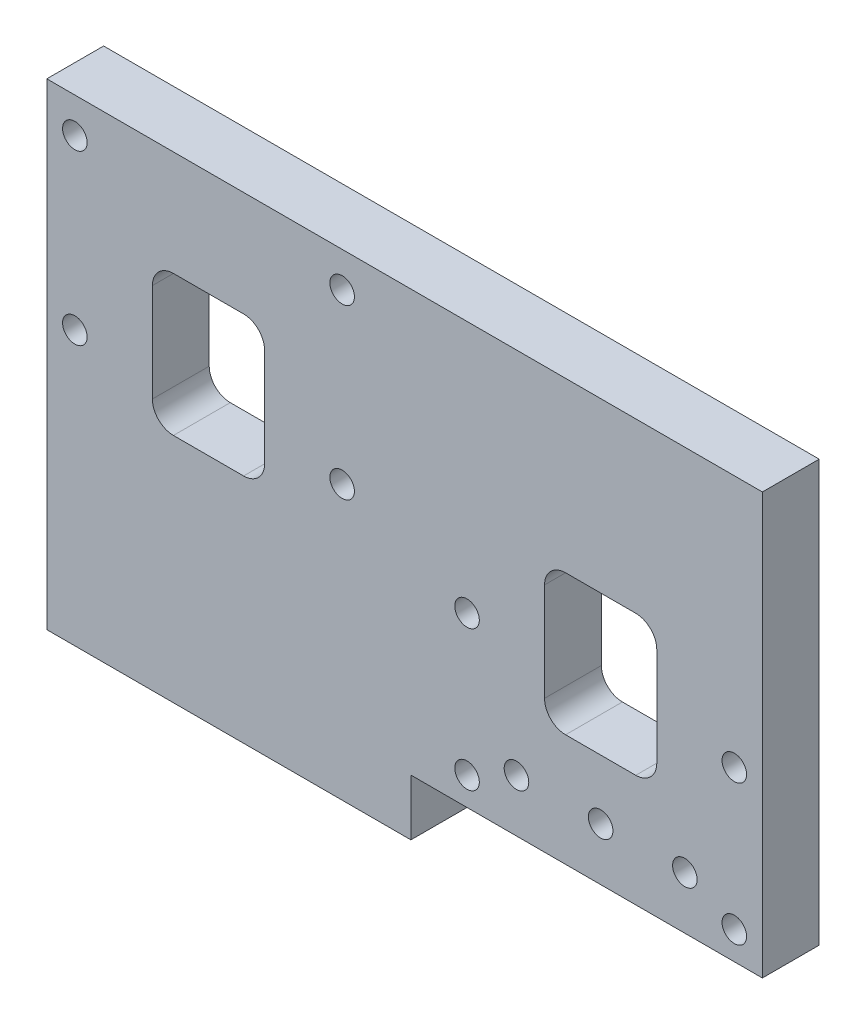
ISO-10303-21;
HEADER;
FILE_DESCRIPTION(('STEP AP214'),'2;1');
FILE_NAME('part.step','',(''),(''),'','','');
FILE_SCHEMA(('AUTOMOTIVE_DESIGN { 1 0 10303 214 1 1 1 1 }'));
ENDSEC;
DATA;
#1=APPLICATION_CONTEXT('core data for automotive mechanical design processes');
#2=APPLICATION_PROTOCOL_DEFINITION('international standard','automotive_design',2000,#1);
#3=PRODUCT_CONTEXT('',#1,'mechanical');
#4=PRODUCT('Part','Part','',(#3));
#5=PRODUCT_RELATED_PRODUCT_CATEGORY('part','',(#4));
#6=PRODUCT_DEFINITION_FORMATION('','',#4);
#7=PRODUCT_DEFINITION_CONTEXT('part definition',#1,'design');
#8=PRODUCT_DEFINITION('design','',#6,#7);
#9=PRODUCT_DEFINITION_SHAPE('','',#8);
#10=(LENGTH_UNIT() NAMED_UNIT(*) SI_UNIT(.MILLI.,.METRE.));
#11=(NAMED_UNIT(*) PLANE_ANGLE_UNIT() SI_UNIT($,.RADIAN.));
#12=(NAMED_UNIT(*) SI_UNIT($,.STERADIAN.) SOLID_ANGLE_UNIT());
#13=UNCERTAINTY_MEASURE_WITH_UNIT(LENGTH_MEASURE(1.E-05),#10,'distance_accuracy_value','');
#14=(GEOMETRIC_REPRESENTATION_CONTEXT(3) GLOBAL_UNCERTAINTY_ASSIGNED_CONTEXT((#13)) GLOBAL_UNIT_ASSIGNED_CONTEXT((#10,
#11,#12)) REPRESENTATION_CONTEXT('',''));
#15=CARTESIAN_POINT('',(0.,0.,0.));
#16=DIRECTION('',(0.,0.,1.));
#17=DIRECTION('',(1.,0.,0.));
#18=AXIS2_PLACEMENT_3D('',#15,#16,#17);
#19=CARTESIAN_POINT('',(0.,0.,8.1));
#20=DIRECTION('',(0.,1.,0.));
#21=DIRECTION('',(0.,0.,1.));
#22=AXIS2_PLACEMENT_3D('',#19,#20,#21);
#23=PLANE('',#22);
#24=DIRECTION('',(0.,0.,1.));
#25=VECTOR('',#24,1.);
#26=CARTESIAN_POINT('',(51.9,0.,0.));
#27=LINE('',#26,#25);
#28=CARTESIAN_POINT('',(51.9,0.,0.));
#29=VERTEX_POINT('',#28);
#30=CARTESIAN_POINT('',(51.9,0.,8.1));
#31=VERTEX_POINT('',#30);
#32=EDGE_CURVE('E222',#29,#31,#27,.T.);
#33=ORIENTED_EDGE('',*,*,#32,.F.);
#34=DIRECTION('',(1.,0.,0.));
#35=VECTOR('',#34,1.);
#36=CARTESIAN_POINT('',(0.,0.,0.));
#37=LINE('',#36,#35);
#38=CARTESIAN_POINT('',(102.,0.,0.));
#39=VERTEX_POINT('',#38);
#40=EDGE_CURVE('E195',#29,#39,#37,.T.);
#41=ORIENTED_EDGE('',*,*,#40,.T.);
#42=DIRECTION('',(0.,0.,-1.));
#43=VECTOR('',#42,1.);
#44=CARTESIAN_POINT('',(102.,0.,8.1));
#45=LINE('',#44,#43);
#46=CARTESIAN_POINT('',(102.,0.,8.1));
#47=VERTEX_POINT('',#46);
#48=EDGE_CURVE('E308',#47,#39,#45,.T.);
#49=ORIENTED_EDGE('',*,*,#48,.F.);
#50=DIRECTION('',(1.,0.,0.));
#51=VECTOR('',#50,1.);
#52=CARTESIAN_POINT('',(0.,0.,8.1));
#53=LINE('',#52,#51);
#54=EDGE_CURVE('E293',#31,#47,#53,.T.);
#55=ORIENTED_EDGE('',*,*,#54,.F.);
#56=EDGE_LOOP('',(#33,#41,#49,#55));
#57=FACE_BOUND('',#56,.T.);
#58=ADVANCED_FACE('F33',(#57),#23,.F.);
#59=CARTESIAN_POINT('',(0.,0.,8.1));
#60=DIRECTION('',(1.,0.,0.));
#61=DIRECTION('',(0.,0.,-1.));
#62=AXIS2_PLACEMENT_3D('',#59,#60,#61);
#63=PLANE('',#62);
#64=DIRECTION('',(0.,-1.,0.));
#65=VECTOR('',#64,1.);
#66=CARTESIAN_POINT('',(0.,0.,0.));
#67=LINE('',#66,#65);
#68=CARTESIAN_POINT('',(0.,60.,0.));
#69=VERTEX_POINT('',#68);
#70=CARTESIAN_POINT('',(0.,-8.,0.));
#71=VERTEX_POINT('',#70);
#72=EDGE_CURVE('E184',#69,#71,#67,.T.);
#73=ORIENTED_EDGE('',*,*,#72,.T.);
#74=DIRECTION('',(0.,0.,1.));
#75=VECTOR('',#74,1.);
#76=CARTESIAN_POINT('',(0.,-8.,0.));
#77=LINE('',#76,#75);
#78=CARTESIAN_POINT('',(0.,-8.,8.1));
#79=VERTEX_POINT('',#78);
#80=EDGE_CURVE('E188',#71,#79,#77,.T.);
#81=ORIENTED_EDGE('',*,*,#80,.T.);
#82=DIRECTION('',(0.,-1.,0.));
#83=VECTOR('',#82,1.);
#84=CARTESIAN_POINT('',(0.,0.,8.1));
#85=LINE('',#84,#83);
#86=CARTESIAN_POINT('',(0.,60.,8.1));
#87=VERTEX_POINT('',#86);
#88=EDGE_CURVE('E291',#87,#79,#85,.T.);
#89=ORIENTED_EDGE('',*,*,#88,.F.);
#90=DIRECTION('',(0.,0.,-1.));
#91=VECTOR('',#90,1.);
#92=CARTESIAN_POINT('',(0.,60.,8.1));
#93=LINE('',#92,#91);
#94=EDGE_CURVE('E191',#87,#69,#93,.T.);
#95=ORIENTED_EDGE('',*,*,#94,.T.);
#96=EDGE_LOOP('',(#73,#81,#89,#95));
#97=FACE_BOUND('',#96,.T.);
#98=ADVANCED_FACE('F186',(#97),#63,.F.);
#99=CARTESIAN_POINT('',(102.,0.,8.1));
#100=DIRECTION('',(-1.,0.,0.));
#101=DIRECTION('',(0.,0.,1.));
#102=AXIS2_PLACEMENT_3D('',#99,#100,#101);
#103=PLANE('',#102);
#104=DIRECTION('',(0.,1.,0.));
#105=VECTOR('',#104,1.);
#106=CARTESIAN_POINT('',(102.,0.,0.));
#107=LINE('',#106,#105);
#108=CARTESIAN_POINT('',(102.,60.,0.));
#109=VERTEX_POINT('',#108);
#110=EDGE_CURVE('E301',#39,#109,#107,.T.);
#111=ORIENTED_EDGE('',*,*,#110,.T.);
#112=DIRECTION('',(0.,0.,-1.));
#113=VECTOR('',#112,1.);
#114=CARTESIAN_POINT('',(102.,60.,8.1));
#115=LINE('',#114,#113);
#116=CARTESIAN_POINT('',(102.,60.,8.1));
#117=VERTEX_POINT('',#116);
#118=EDGE_CURVE('E305',#117,#109,#115,.T.);
#119=ORIENTED_EDGE('',*,*,#118,.F.);
#120=DIRECTION('',(0.,1.,0.));
#121=VECTOR('',#120,1.);
#122=CARTESIAN_POINT('',(102.,0.,8.1));
#123=LINE('',#122,#121);
#124=EDGE_CURVE('E296',#47,#117,#123,.T.);
#125=ORIENTED_EDGE('',*,*,#124,.F.);
#126=ORIENTED_EDGE('',*,*,#48,.T.);
#127=EDGE_LOOP('',(#111,#119,#125,#126));
#128=FACE_BOUND('',#127,.T.);
#129=ADVANCED_FACE('F439',(#128),#103,.F.);
#130=CARTESIAN_POINT('',(0.,60.,8.1));
#131=DIRECTION('',(0.,-1.,0.));
#132=DIRECTION('',(0.,0.,-1.));
#133=AXIS2_PLACEMENT_3D('',#130,#131,#132);
#134=PLANE('',#133);
#135=DIRECTION('',(-1.,0.,0.));
#136=VECTOR('',#135,1.);
#137=CARTESIAN_POINT('',(0.,60.,0.));
#138=LINE('',#137,#136);
#139=EDGE_CURVE('E294',#109,#69,#138,.T.);
#140=ORIENTED_EDGE('',*,*,#139,.T.);
#141=ORIENTED_EDGE('',*,*,#94,.F.);
#142=DIRECTION('',(-1.,0.,0.));
#143=VECTOR('',#142,1.);
#144=CARTESIAN_POINT('',(0.,60.,8.1));
#145=LINE('',#144,#143);
#146=EDGE_CURVE('E298',#117,#87,#145,.T.);
#147=ORIENTED_EDGE('',*,*,#146,.F.);
#148=ORIENTED_EDGE('',*,*,#118,.T.);
#149=EDGE_LOOP('',(#140,#141,#147,#148));
#150=FACE_BOUND('',#149,.T.);
#151=ADVANCED_FACE('F538',(#150),#134,.F.);
#152=CARTESIAN_POINT('',(0.,0.,8.1));
#153=DIRECTION('',(0.,0.,-1.));
#154=DIRECTION('',(-1.,0.,0.));
#155=AXIS2_PLACEMENT_3D('',#152,#153,#154);
#156=PLANE('',#155);
#157=DIRECTION('',(-1.,0.,0.));
#158=VECTOR('',#157,1.);
#159=CARTESIAN_POINT('',(86.95,36.,8.1));
#160=LINE('',#159,#158);
#161=CARTESIAN_POINT('',(83.95,36.,8.1));
#162=VERTEX_POINT('',#161);
#163=CARTESIAN_POINT('',(73.95,36.,8.1));
#164=VERTEX_POINT('',#163);
#165=EDGE_CURVE('E756',#162,#164,#160,.T.);
#166=ORIENTED_EDGE('',*,*,#165,.F.);
#167=CARTESIAN_POINT('',(83.95,33.,8.1));
#168=DIRECTION('',(0.,0.,-1.));
#169=DIRECTION('',(-1.,0.,0.));
#170=AXIS2_PLACEMENT_3D('',#167,#168,#169);
#171=CIRCLE('',#170,3.);
#172=CARTESIAN_POINT('',(86.95,33.,8.1));
#173=VERTEX_POINT('',#172);
#174=EDGE_CURVE('E354',#162,#173,#171,.T.);
#175=ORIENTED_EDGE('',*,*,#174,.T.);
#176=DIRECTION('',(0.,1.,0.));
#177=VECTOR('',#176,1.);
#178=CARTESIAN_POINT('',(86.95,36.,8.1));
#179=LINE('',#178,#177);
#180=CARTESIAN_POINT('',(86.95,19.,8.1));
#181=VERTEX_POINT('',#180);
#182=EDGE_CURVE('E755',#181,#173,#179,.T.);
#183=ORIENTED_EDGE('',*,*,#182,.F.);
#184=CARTESIAN_POINT('',(83.95,19.,8.1));
#185=DIRECTION('',(0.,0.,-1.));
#186=DIRECTION('',(-1.,0.,0.));
#187=AXIS2_PLACEMENT_3D('',#184,#185,#186);
#188=CIRCLE('',#187,3.);
#189=CARTESIAN_POINT('',(83.95,16.,8.1));
#190=VERTEX_POINT('',#189);
#191=EDGE_CURVE('E350',#181,#190,#188,.T.);
#192=ORIENTED_EDGE('',*,*,#191,.T.);
#193=DIRECTION('',(1.,0.,0.));
#194=VECTOR('',#193,1.);
#195=CARTESIAN_POINT('',(86.95,16.,8.1));
#196=LINE('',#195,#194);
#197=CARTESIAN_POINT('',(73.95,16.,8.1));
#198=VERTEX_POINT('',#197);
#199=EDGE_CURVE('E404',#198,#190,#196,.T.);
#200=ORIENTED_EDGE('',*,*,#199,.F.);
#201=CARTESIAN_POINT('',(73.95,19.,8.1));
#202=DIRECTION('',(0.,0.,-1.));
#203=DIRECTION('',(-1.,0.,0.));
#204=AXIS2_PLACEMENT_3D('',#201,#202,#203);
#205=CIRCLE('',#204,3.);
#206=CARTESIAN_POINT('',(70.95,19.,8.1));
#207=VERTEX_POINT('',#206);
#208=EDGE_CURVE('E362',#198,#207,#205,.T.);
#209=ORIENTED_EDGE('',*,*,#208,.T.);
#210=DIRECTION('',(0.,-1.,0.));
#211=VECTOR('',#210,1.);
#212=CARTESIAN_POINT('',(70.95,36.,8.1));
#213=LINE('',#212,#211);
#214=CARTESIAN_POINT('',(70.95,33.,8.1));
#215=VERTEX_POINT('',#214);
#216=EDGE_CURVE('E761',#215,#207,#213,.T.);
#217=ORIENTED_EDGE('',*,*,#216,.F.);
#218=CARTESIAN_POINT('',(73.95,33.,8.1));
#219=DIRECTION('',(0.,0.,-1.));
#220=DIRECTION('',(-1.,0.,0.));
#221=AXIS2_PLACEMENT_3D('',#218,#219,#220);
#222=CIRCLE('',#221,3.);
#223=EDGE_CURVE('E358',#215,#164,#222,.T.);
#224=ORIENTED_EDGE('',*,*,#223,.T.);
#225=EDGE_LOOP('',(#166,#175,#183,#192,#200,#209,#217,#224));
#226=FACE_BOUND('',#225,.T.);
#227=DIRECTION('',(1.,0.,0.));
#228=VECTOR('',#227,1.);
#229=CARTESIAN_POINT('',(15.05,25.,8.1));
#230=LINE('',#229,#228);
#231=CARTESIAN_POINT('',(18.05,25.,8.1));
#232=VERTEX_POINT('',#231);
#233=CARTESIAN_POINT('',(28.05,25.,8.1));
#234=VERTEX_POINT('',#233);
#235=EDGE_CURVE('E410',#232,#234,#230,.T.);
#236=ORIENTED_EDGE('',*,*,#235,.F.);
#237=CARTESIAN_POINT('',(18.05,28.,8.1));
#238=DIRECTION('',(0.,0.,-1.));
#239=DIRECTION('',(-1.,0.,0.));
#240=AXIS2_PLACEMENT_3D('',#237,#238,#239);
#241=CIRCLE('',#240,3.);
#242=CARTESIAN_POINT('',(15.05,28.,8.1));
#243=VERTEX_POINT('',#242);
#244=EDGE_CURVE('E366',#232,#243,#241,.T.);
#245=ORIENTED_EDGE('',*,*,#244,.T.);
#246=DIRECTION('',(0.,-1.,0.));
#247=VECTOR('',#246,1.);
#248=CARTESIAN_POINT('',(15.05,45.,8.1));
#249=LINE('',#248,#247);
#250=CARTESIAN_POINT('',(15.05,42.,8.1));
#251=VERTEX_POINT('',#250);
#252=EDGE_CURVE('E383',#251,#243,#249,.T.);
#253=ORIENTED_EDGE('',*,*,#252,.F.);
#254=CARTESIAN_POINT('',(18.05,42.,8.1));
#255=DIRECTION('',(0.,0.,-1.));
#256=DIRECTION('',(-1.,0.,0.));
#257=AXIS2_PLACEMENT_3D('',#254,#255,#256);
#258=CIRCLE('',#257,3.);
#259=CARTESIAN_POINT('',(18.05,45.,8.1));
#260=VERTEX_POINT('',#259);
#261=EDGE_CURVE('E41',#251,#260,#258,.T.);
#262=ORIENTED_EDGE('',*,*,#261,.T.);
#263=DIRECTION('',(-1.,0.,0.));
#264=VECTOR('',#263,1.);
#265=CARTESIAN_POINT('',(15.05,45.,8.1));
#266=LINE('',#265,#264);
#267=CARTESIAN_POINT('',(28.05,45.,8.1));
#268=VERTEX_POINT('',#267);
#269=EDGE_CURVE('E217',#268,#260,#266,.T.);
#270=ORIENTED_EDGE('',*,*,#269,.F.);
#271=CARTESIAN_POINT('',(28.05,42.,8.1));
#272=DIRECTION('',(0.,0.,-1.));
#273=DIRECTION('',(-1.,0.,0.));
#274=AXIS2_PLACEMENT_3D('',#271,#272,#273);
#275=CIRCLE('',#274,3.);
#276=CARTESIAN_POINT('',(31.05,42.,8.1));
#277=VERTEX_POINT('',#276);
#278=EDGE_CURVE('E374',#268,#277,#275,.T.);
#279=ORIENTED_EDGE('',*,*,#278,.T.);
#280=DIRECTION('',(0.,1.,0.));
#281=VECTOR('',#280,1.);
#282=CARTESIAN_POINT('',(31.05,45.,8.1));
#283=LINE('',#282,#281);
#284=CARTESIAN_POINT('',(31.05,28.,8.1));
#285=VERTEX_POINT('',#284);
#286=EDGE_CURVE('E389',#285,#277,#283,.T.);
#287=ORIENTED_EDGE('',*,*,#286,.F.);
#288=CARTESIAN_POINT('',(28.05,28.,8.1));
#289=DIRECTION('',(0.,0.,-1.));
#290=DIRECTION('',(-1.,0.,0.));
#291=AXIS2_PLACEMENT_3D('',#288,#289,#290);
#292=CIRCLE('',#291,3.);
#293=EDGE_CURVE('E370',#285,#234,#292,.T.);
#294=ORIENTED_EDGE('',*,*,#293,.T.);
#295=EDGE_LOOP('',(#236,#245,#253,#262,#270,#279,#287,#294));
#296=FACE_BOUND('',#295,.T.);
#297=CARTESIAN_POINT('',(90.95,7.5,8.1));
#298=DIRECTION('',(0.,0.,1.));
#299=DIRECTION('',(-1.,0.,0.));
#300=AXIS2_PLACEMENT_3D('',#297,#298,#299);
#301=CIRCLE('',#300,1.75);
#302=CARTESIAN_POINT('',(89.2,7.5,8.1));
#303=VERTEX_POINT('',#302);
#304=EDGE_CURVE('E225',#303,#303,#301,.T.);
#305=ORIENTED_EDGE('',*,*,#304,.F.);
#306=EDGE_LOOP('',(#305));
#307=FACE_BOUND('',#306,.T.);
#308=CARTESIAN_POINT('',(78.95,7.5,8.1));
#309=DIRECTION('',(0.,0.,1.));
#310=DIRECTION('',(1.,0.,0.));
#311=AXIS2_PLACEMENT_3D('',#308,#309,#310);
#312=CIRCLE('',#311,1.75);
#313=CARTESIAN_POINT('',(80.7,7.5,8.1));
#314=VERTEX_POINT('',#313);
#315=EDGE_CURVE('E249',#314,#314,#312,.T.);
#316=ORIENTED_EDGE('',*,*,#315,.F.);
#317=EDGE_LOOP('',(#316));
#318=FACE_BOUND('',#317,.T.);
#319=CARTESIAN_POINT('',(66.95,7.5,8.1));
#320=DIRECTION('',(0.,0.,1.));
#321=DIRECTION('',(1.,0.,0.));
#322=AXIS2_PLACEMENT_3D('',#319,#320,#321);
#323=CIRCLE('',#322,1.75);
#324=CARTESIAN_POINT('',(68.7,7.5,8.1));
#325=VERTEX_POINT('',#324);
#326=EDGE_CURVE('E243',#325,#325,#323,.T.);
#327=ORIENTED_EDGE('',*,*,#326,.F.);
#328=EDGE_LOOP('',(#327));
#329=FACE_BOUND('',#328,.T.);
#330=CARTESIAN_POINT('',(42.1,55.,8.1));
#331=DIRECTION('',(0.,0.,1.));
#332=DIRECTION('',(-1.,0.,0.));
#333=AXIS2_PLACEMENT_3D('',#330,#331,#332);
#334=CIRCLE('',#333,1.75);
#335=CARTESIAN_POINT('',(40.35,55.,8.1));
#336=VERTEX_POINT('',#335);
#337=EDGE_CURVE('E237',#336,#336,#334,.T.);
#338=ORIENTED_EDGE('',*,*,#337,.F.);
#339=EDGE_LOOP('',(#338));
#340=FACE_BOUND('',#339,.T.);
#341=CARTESIAN_POINT('',(42.1,31.,8.1));
#342=DIRECTION('',(0.,0.,1.));
#343=DIRECTION('',(-1.,0.,0.));
#344=AXIS2_PLACEMENT_3D('',#341,#342,#343);
#345=CIRCLE('',#344,1.75);
#346=CARTESIAN_POINT('',(40.35,31.,8.1));
#347=VERTEX_POINT('',#346);
#348=EDGE_CURVE('E231',#347,#347,#345,.T.);
#349=ORIENTED_EDGE('',*,*,#348,.F.);
#350=EDGE_LOOP('',(#349));
#351=FACE_BOUND('',#350,.T.);
#352=CARTESIAN_POINT('',(4.,31.,8.1));
#353=DIRECTION('',(0.,0.,1.));
#354=DIRECTION('',(1.,0.,0.));
#355=AXIS2_PLACEMENT_3D('',#352,#353,#354);
#356=CIRCLE('',#355,1.75);
#357=CARTESIAN_POINT('',(5.75,31.,8.1));
#358=VERTEX_POINT('',#357);
#359=EDGE_CURVE('E279',#358,#358,#356,.T.);
#360=ORIENTED_EDGE('',*,*,#359,.F.);
#361=EDGE_LOOP('',(#360));
#362=FACE_BOUND('',#361,.T.);
#363=CARTESIAN_POINT('',(98.,24.,8.1));
#364=DIRECTION('',(0.,0.,1.));
#365=DIRECTION('',(1.,0.,0.));
#366=AXIS2_PLACEMENT_3D('',#363,#364,#365);
#367=CIRCLE('',#366,1.75);
#368=CARTESIAN_POINT('',(99.75,24.,8.1));
#369=VERTEX_POINT('',#368);
#370=EDGE_CURVE('E260',#369,#369,#367,.T.);
#371=ORIENTED_EDGE('',*,*,#370,.F.);
#372=EDGE_LOOP('',(#371));
#373=FACE_BOUND('',#372,.T.);
#374=CARTESIAN_POINT('',(98.,4.,8.1));
#375=DIRECTION('',(0.,0.,1.));
#376=DIRECTION('',(1.,0.,0.));
#377=AXIS2_PLACEMENT_3D('',#374,#375,#376);
#378=CIRCLE('',#377,1.75);
#379=CARTESIAN_POINT('',(99.75,4.,8.1));
#380=VERTEX_POINT('',#379);
#381=EDGE_CURVE('E261',#380,#380,#378,.T.);
#382=ORIENTED_EDGE('',*,*,#381,.F.);
#383=EDGE_LOOP('',(#382));
#384=FACE_BOUND('',#383,.T.);
#385=CARTESIAN_POINT('',(59.9,4.,8.1));
#386=DIRECTION('',(0.,0.,1.));
#387=DIRECTION('',(-1.,0.,0.));
#388=AXIS2_PLACEMENT_3D('',#385,#386,#387);
#389=CIRCLE('',#388,1.75);
#390=CARTESIAN_POINT('',(58.15,4.,8.1));
#391=VERTEX_POINT('',#390);
#392=EDGE_CURVE('E267',#391,#391,#389,.T.);
#393=ORIENTED_EDGE('',*,*,#392,.F.);
#394=EDGE_LOOP('',(#393));
#395=FACE_BOUND('',#394,.T.);
#396=CARTESIAN_POINT('',(59.9,24.,8.1));
#397=DIRECTION('',(0.,0.,1.));
#398=DIRECTION('',(-1.,0.,0.));
#399=AXIS2_PLACEMENT_3D('',#396,#397,#398);
#400=CIRCLE('',#399,1.75);
#401=CARTESIAN_POINT('',(58.15,24.,8.1));
#402=VERTEX_POINT('',#401);
#403=EDGE_CURVE('E230',#402,#402,#400,.T.);
#404=ORIENTED_EDGE('',*,*,#403,.F.);
#405=EDGE_LOOP('',(#404));
#406=FACE_BOUND('',#405,.T.);
#407=CARTESIAN_POINT('',(4.,55.,8.1));
#408=DIRECTION('',(0.,0.,1.));
#409=DIRECTION('',(1.,0.,0.));
#410=AXIS2_PLACEMENT_3D('',#407,#408,#409);
#411=CIRCLE('',#410,1.75);
#412=CARTESIAN_POINT('',(5.75,55.,8.1));
#413=VERTEX_POINT('',#412);
#414=EDGE_CURVE('E278',#413,#413,#411,.T.);
#415=ORIENTED_EDGE('',*,*,#414,.F.);
#416=EDGE_LOOP('',(#415));
#417=FACE_BOUND('',#416,.T.);
#418=ORIENTED_EDGE('',*,*,#88,.T.);
#419=DIRECTION('',(1.,0.,0.));
#420=VECTOR('',#419,1.);
#421=CARTESIAN_POINT('',(0.,-8.,8.1));
#422=LINE('',#421,#420);
#423=CARTESIAN_POINT('',(51.9,-8.,8.1));
#424=VERTEX_POINT('',#423);
#425=EDGE_CURVE('E203',#79,#424,#422,.T.);
#426=ORIENTED_EDGE('',*,*,#425,.T.);
#427=DIRECTION('',(0.,1.,0.));
#428=VECTOR('',#427,1.);
#429=CARTESIAN_POINT('',(51.9,0.,8.1));
#430=LINE('',#429,#428);
#431=EDGE_CURVE('E211',#424,#31,#430,.T.);
#432=ORIENTED_EDGE('',*,*,#431,.T.);
#433=ORIENTED_EDGE('',*,*,#54,.T.);
#434=ORIENTED_EDGE('',*,*,#124,.T.);
#435=ORIENTED_EDGE('',*,*,#146,.T.);
#436=EDGE_LOOP('',(#418,#426,#432,#433,#434,#435));
#437=FACE_BOUND('',#436,.T.);
#438=ADVANCED_FACE('F380',(#226,#296,#307,#318,#329,#340,#351,#362,#373,#384,#395,#406,#417,
#437),#156,.F.);
#439=CARTESIAN_POINT('',(0.,0.,0.));
#440=DIRECTION('',(0.,0.,-1.));
#441=DIRECTION('',(-1.,0.,0.));
#442=AXIS2_PLACEMENT_3D('',#439,#440,#441);
#443=PLANE('',#442);
#444=DIRECTION('',(1.,0.,0.));
#445=VECTOR('',#444,1.);
#446=CARTESIAN_POINT('',(86.95,16.,0.));
#447=LINE('',#446,#445);
#448=CARTESIAN_POINT('',(73.95,16.,0.));
#449=VERTEX_POINT('',#448);
#450=CARTESIAN_POINT('',(83.95,16.,0.));
#451=VERTEX_POINT('',#450);
#452=EDGE_CURVE('E411',#449,#451,#447,.T.);
#453=ORIENTED_EDGE('',*,*,#452,.T.);
#454=CARTESIAN_POINT('',(83.95,19.,0.));
#455=DIRECTION('',(0.,0.,-1.));
#456=DIRECTION('',(-1.,0.,0.));
#457=AXIS2_PLACEMENT_3D('',#454,#455,#456);
#458=CIRCLE('',#457,3.);
#459=CARTESIAN_POINT('',(86.95,19.,0.));
#460=VERTEX_POINT('',#459);
#461=EDGE_CURVE('E352',#451,#460,#458,.F.);
#462=ORIENTED_EDGE('',*,*,#461,.T.);
#463=DIRECTION('',(0.,1.,0.));
#464=VECTOR('',#463,1.);
#465=CARTESIAN_POINT('',(86.95,36.,0.));
#466=LINE('',#465,#464);
#467=CARTESIAN_POINT('',(86.95,33.,0.));
#468=VERTEX_POINT('',#467);
#469=EDGE_CURVE('E749',#460,#468,#466,.T.);
#470=ORIENTED_EDGE('',*,*,#469,.T.);
#471=CARTESIAN_POINT('',(83.95,33.,0.));
#472=DIRECTION('',(0.,0.,-1.));
#473=DIRECTION('',(-1.,0.,0.));
#474=AXIS2_PLACEMENT_3D('',#471,#472,#473);
#475=CIRCLE('',#474,3.);
#476=CARTESIAN_POINT('',(83.95,36.,0.));
#477=VERTEX_POINT('',#476);
#478=EDGE_CURVE('E356',#468,#477,#475,.F.);
#479=ORIENTED_EDGE('',*,*,#478,.T.);
#480=DIRECTION('',(-1.,0.,0.));
#481=VECTOR('',#480,1.);
#482=CARTESIAN_POINT('',(86.95,36.,0.));
#483=LINE('',#482,#481);
#484=CARTESIAN_POINT('',(73.95,36.,0.));
#485=VERTEX_POINT('',#484);
#486=EDGE_CURVE('E742',#477,#485,#483,.T.);
#487=ORIENTED_EDGE('',*,*,#486,.T.);
#488=CARTESIAN_POINT('',(73.95,33.,0.));
#489=DIRECTION('',(0.,0.,-1.));
#490=DIRECTION('',(-1.,0.,0.));
#491=AXIS2_PLACEMENT_3D('',#488,#489,#490);
#492=CIRCLE('',#491,3.);
#493=CARTESIAN_POINT('',(70.95,33.,0.));
#494=VERTEX_POINT('',#493);
#495=EDGE_CURVE('E360',#485,#494,#492,.F.);
#496=ORIENTED_EDGE('',*,*,#495,.T.);
#497=DIRECTION('',(0.,-1.,0.));
#498=VECTOR('',#497,1.);
#499=CARTESIAN_POINT('',(70.95,36.,0.));
#500=LINE('',#499,#498);
#501=CARTESIAN_POINT('',(70.95,19.,0.));
#502=VERTEX_POINT('',#501);
#503=EDGE_CURVE('E748',#494,#502,#500,.T.);
#504=ORIENTED_EDGE('',*,*,#503,.T.);
#505=CARTESIAN_POINT('',(73.95,19.,0.));
#506=DIRECTION('',(0.,0.,-1.));
#507=DIRECTION('',(-1.,0.,0.));
#508=AXIS2_PLACEMENT_3D('',#505,#506,#507);
#509=CIRCLE('',#508,3.);
#510=EDGE_CURVE('E364',#502,#449,#509,.F.);
#511=ORIENTED_EDGE('',*,*,#510,.T.);
#512=EDGE_LOOP('',(#453,#462,#470,#479,#487,#496,#504,#511));
#513=FACE_BOUND('',#512,.T.);
#514=DIRECTION('',(-1.,0.,0.));
#515=VECTOR('',#514,1.);
#516=CARTESIAN_POINT('',(15.05,45.,0.));
#517=LINE('',#516,#515);
#518=CARTESIAN_POINT('',(28.05,45.,0.));
#519=VERTEX_POINT('',#518);
#520=CARTESIAN_POINT('',(18.05,45.,0.));
#521=VERTEX_POINT('',#520);
#522=EDGE_CURVE('E220',#519,#521,#517,.T.);
#523=ORIENTED_EDGE('',*,*,#522,.T.);
#524=CARTESIAN_POINT('',(18.05,42.,0.));
#525=DIRECTION('',(0.,0.,-1.));
#526=DIRECTION('',(-1.,0.,0.));
#527=AXIS2_PLACEMENT_3D('',#524,#525,#526);
#528=CIRCLE('',#527,3.);
#529=CARTESIAN_POINT('',(15.05,42.,0.));
#530=VERTEX_POINT('',#529);
#531=EDGE_CURVE('E11',#521,#530,#528,.F.);
#532=ORIENTED_EDGE('',*,*,#531,.T.);
#533=DIRECTION('',(0.,-1.,0.));
#534=VECTOR('',#533,1.);
#535=CARTESIAN_POINT('',(15.05,45.,0.));
#536=LINE('',#535,#534);
#537=CARTESIAN_POINT('',(15.05,28.,0.));
#538=VERTEX_POINT('',#537);
#539=EDGE_CURVE('E388',#530,#538,#536,.T.);
#540=ORIENTED_EDGE('',*,*,#539,.T.);
#541=CARTESIAN_POINT('',(18.05,28.,0.));
#542=DIRECTION('',(0.,0.,-1.));
#543=DIRECTION('',(-1.,0.,0.));
#544=AXIS2_PLACEMENT_3D('',#541,#542,#543);
#545=CIRCLE('',#544,3.);
#546=CARTESIAN_POINT('',(18.05,25.,0.));
#547=VERTEX_POINT('',#546);
#548=EDGE_CURVE('E368',#538,#547,#545,.F.);
#549=ORIENTED_EDGE('',*,*,#548,.T.);
#550=DIRECTION('',(1.,0.,0.));
#551=VECTOR('',#550,1.);
#552=CARTESIAN_POINT('',(15.05,25.,0.));
#553=LINE('',#552,#551);
#554=CARTESIAN_POINT('',(28.05,25.,0.));
#555=VERTEX_POINT('',#554);
#556=EDGE_CURVE('E398',#547,#555,#553,.T.);
#557=ORIENTED_EDGE('',*,*,#556,.T.);
#558=CARTESIAN_POINT('',(28.05,28.,0.));
#559=DIRECTION('',(0.,0.,-1.));
#560=DIRECTION('',(-1.,0.,0.));
#561=AXIS2_PLACEMENT_3D('',#558,#559,#560);
#562=CIRCLE('',#561,3.);
#563=CARTESIAN_POINT('',(31.05,28.,0.));
#564=VERTEX_POINT('',#563);
#565=EDGE_CURVE('E372',#555,#564,#562,.F.);
#566=ORIENTED_EDGE('',*,*,#565,.T.);
#567=DIRECTION('',(0.,1.,0.));
#568=VECTOR('',#567,1.);
#569=CARTESIAN_POINT('',(31.05,45.,0.));
#570=LINE('',#569,#568);
#571=CARTESIAN_POINT('',(31.05,42.,0.));
#572=VERTEX_POINT('',#571);
#573=EDGE_CURVE('E401',#564,#572,#570,.T.);
#574=ORIENTED_EDGE('',*,*,#573,.T.);
#575=CARTESIAN_POINT('',(28.05,42.,0.));
#576=DIRECTION('',(0.,0.,-1.));
#577=DIRECTION('',(-1.,0.,0.));
#578=AXIS2_PLACEMENT_3D('',#575,#576,#577);
#579=CIRCLE('',#578,3.);
#580=EDGE_CURVE('E55',#572,#519,#579,.F.);
#581=ORIENTED_EDGE('',*,*,#580,.T.);
#582=EDGE_LOOP('',(#523,#532,#540,#549,#557,#566,#574,#581));
#583=FACE_BOUND('',#582,.T.);
#584=CARTESIAN_POINT('',(90.95,7.5,0.));
#585=DIRECTION('',(0.,0.,1.));
#586=DIRECTION('',(-1.,0.,0.));
#587=AXIS2_PLACEMENT_3D('',#584,#585,#586);
#588=CIRCLE('',#587,1.75);
#589=CARTESIAN_POINT('',(89.2,7.5,0.));
#590=VERTEX_POINT('',#589);
#591=EDGE_CURVE('E252',#590,#590,#588,.T.);
#592=ORIENTED_EDGE('',*,*,#591,.T.);
#593=EDGE_LOOP('',(#592));
#594=FACE_BOUND('',#593,.T.);
#595=CARTESIAN_POINT('',(78.95,7.5,0.));
#596=DIRECTION('',(0.,0.,1.));
#597=DIRECTION('',(1.,0.,0.));
#598=AXIS2_PLACEMENT_3D('',#595,#596,#597);
#599=CIRCLE('',#598,1.75);
#600=CARTESIAN_POINT('',(80.7,7.5,0.));
#601=VERTEX_POINT('',#600);
#602=EDGE_CURVE('E246',#601,#601,#599,.T.);
#603=ORIENTED_EDGE('',*,*,#602,.T.);
#604=EDGE_LOOP('',(#603));
#605=FACE_BOUND('',#604,.T.);
#606=CARTESIAN_POINT('',(66.95,7.5,0.));
#607=DIRECTION('',(0.,0.,1.));
#608=DIRECTION('',(1.,0.,0.));
#609=AXIS2_PLACEMENT_3D('',#606,#607,#608);
#610=CIRCLE('',#609,1.75);
#611=CARTESIAN_POINT('',(68.7,7.5,0.));
#612=VERTEX_POINT('',#611);
#613=EDGE_CURVE('E240',#612,#612,#610,.T.);
#614=ORIENTED_EDGE('',*,*,#613,.T.);
#615=EDGE_LOOP('',(#614));
#616=FACE_BOUND('',#615,.T.);
#617=CARTESIAN_POINT('',(42.1,55.,0.));
#618=DIRECTION('',(0.,0.,1.));
#619=DIRECTION('',(-1.,0.,0.));
#620=AXIS2_PLACEMENT_3D('',#617,#618,#619);
#621=CIRCLE('',#620,1.75);
#622=CARTESIAN_POINT('',(40.35,55.,0.));
#623=VERTEX_POINT('',#622);
#624=EDGE_CURVE('E234',#623,#623,#621,.T.);
#625=ORIENTED_EDGE('',*,*,#624,.T.);
#626=EDGE_LOOP('',(#625));
#627=FACE_BOUND('',#626,.T.);
#628=CARTESIAN_POINT('',(42.1,31.,0.));
#629=DIRECTION('',(0.,0.,1.));
#630=DIRECTION('',(-1.,0.,0.));
#631=AXIS2_PLACEMENT_3D('',#628,#629,#630);
#632=CIRCLE('',#631,1.75);
#633=CARTESIAN_POINT('',(40.35,31.,0.));
#634=VERTEX_POINT('',#633);
#635=EDGE_CURVE('E227',#634,#634,#632,.T.);
#636=ORIENTED_EDGE('',*,*,#635,.T.);
#637=EDGE_LOOP('',(#636));
#638=FACE_BOUND('',#637,.T.);
#639=CARTESIAN_POINT('',(4.,31.,0.));
#640=DIRECTION('',(0.,0.,1.));
#641=DIRECTION('',(1.,0.,0.));
#642=AXIS2_PLACEMENT_3D('',#639,#640,#641);
#643=CIRCLE('',#642,1.75);
#644=CARTESIAN_POINT('',(5.75,31.,0.));
#645=VERTEX_POINT('',#644);
#646=EDGE_CURVE('E275',#645,#645,#643,.T.);
#647=ORIENTED_EDGE('',*,*,#646,.T.);
#648=EDGE_LOOP('',(#647));
#649=FACE_BOUND('',#648,.T.);
#650=CARTESIAN_POINT('',(98.,24.,0.));
#651=DIRECTION('',(0.,0.,1.));
#652=DIRECTION('',(1.,0.,0.));
#653=AXIS2_PLACEMENT_3D('',#650,#651,#652);
#654=CIRCLE('',#653,1.75);
#655=CARTESIAN_POINT('',(99.75,24.,0.));
#656=VERTEX_POINT('',#655);
#657=EDGE_CURVE('E282',#656,#656,#654,.T.);
#658=ORIENTED_EDGE('',*,*,#657,.T.);
#659=EDGE_LOOP('',(#658));
#660=FACE_BOUND('',#659,.T.);
#661=CARTESIAN_POINT('',(98.,4.,0.));
#662=DIRECTION('',(0.,0.,1.));
#663=DIRECTION('',(1.,0.,0.));
#664=AXIS2_PLACEMENT_3D('',#661,#662,#663);
#665=CIRCLE('',#664,1.75);
#666=CARTESIAN_POINT('',(99.75,4.,0.));
#667=VERTEX_POINT('',#666);
#668=EDGE_CURVE('E257',#667,#667,#665,.T.);
#669=ORIENTED_EDGE('',*,*,#668,.T.);
#670=EDGE_LOOP('',(#669));
#671=FACE_BOUND('',#670,.T.);
#672=CARTESIAN_POINT('',(59.9,4.,0.));
#673=DIRECTION('',(0.,0.,1.));
#674=DIRECTION('',(-1.,0.,0.));
#675=AXIS2_PLACEMENT_3D('',#672,#673,#674);
#676=CIRCLE('',#675,1.75);
#677=CARTESIAN_POINT('',(58.15,4.,0.));
#678=VERTEX_POINT('',#677);
#679=EDGE_CURVE('E264',#678,#678,#676,.T.);
#680=ORIENTED_EDGE('',*,*,#679,.T.);
#681=EDGE_LOOP('',(#680));
#682=FACE_BOUND('',#681,.T.);
#683=CARTESIAN_POINT('',(59.9,24.,0.));
#684=DIRECTION('',(0.,0.,1.));
#685=DIRECTION('',(-1.,0.,0.));
#686=AXIS2_PLACEMENT_3D('',#683,#684,#685);
#687=CIRCLE('',#686,1.75);
#688=CARTESIAN_POINT('',(58.15,24.,0.));
#689=VERTEX_POINT('',#688);
#690=EDGE_CURVE('E270',#689,#689,#687,.T.);
#691=ORIENTED_EDGE('',*,*,#690,.T.);
#692=EDGE_LOOP('',(#691));
#693=FACE_BOUND('',#692,.T.);
#694=CARTESIAN_POINT('',(4.,55.,0.));
#695=DIRECTION('',(0.,0.,1.));
#696=DIRECTION('',(1.,0.,0.));
#697=AXIS2_PLACEMENT_3D('',#694,#695,#696);
#698=CIRCLE('',#697,1.75);
#699=CARTESIAN_POINT('',(5.75,55.,0.));
#700=VERTEX_POINT('',#699);
#701=EDGE_CURVE('E196',#700,#700,#698,.T.);
#702=ORIENTED_EDGE('',*,*,#701,.T.);
#703=EDGE_LOOP('',(#702));
#704=FACE_BOUND('',#703,.T.);
#705=ORIENTED_EDGE('',*,*,#72,.F.);
#706=ORIENTED_EDGE('',*,*,#139,.F.);
#707=ORIENTED_EDGE('',*,*,#110,.F.);
#708=ORIENTED_EDGE('',*,*,#40,.F.);
#709=DIRECTION('',(0.,1.,0.));
#710=VECTOR('',#709,1.);
#711=CARTESIAN_POINT('',(51.9,0.,0.));
#712=LINE('',#711,#710);
#713=CARTESIAN_POINT('',(51.9,-8.,0.));
#714=VERTEX_POINT('',#713);
#715=EDGE_CURVE('E205',#714,#29,#712,.T.);
#716=ORIENTED_EDGE('',*,*,#715,.F.);
#717=DIRECTION('',(1.,0.,0.));
#718=VECTOR('',#717,1.);
#719=CARTESIAN_POINT('',(0.,-8.,0.));
#720=LINE('',#719,#718);
#721=EDGE_CURVE('E201',#71,#714,#720,.T.);
#722=ORIENTED_EDGE('',*,*,#721,.F.);
#723=EDGE_LOOP('',(#705,#706,#707,#708,#716,#722));
#724=FACE_BOUND('',#723,.T.);
#725=ADVANCED_FACE('F208',(#513,#583,#594,#605,#616,#627,#638,#649,#660,#671,#682,#693,#704,
#724),#443,.T.);
#726=CARTESIAN_POINT('',(4.,55.,0.));
#727=DIRECTION('',(0.,0.,1.));
#728=DIRECTION('',(1.,0.,0.));
#729=AXIS2_PLACEMENT_3D('',#726,#727,#728);
#730=CYLINDRICAL_SURFACE('',#729,1.75);
#731=ORIENTED_EDGE('',*,*,#701,.F.);
#732=EDGE_LOOP('',(#731));
#733=FACE_BOUND('',#732,.T.);
#734=ORIENTED_EDGE('',*,*,#414,.T.);
#735=EDGE_LOOP('',(#734));
#736=FACE_BOUND('',#735,.T.);
#737=ADVANCED_FACE('F525',(#733,#736),#730,.F.);
#738=CARTESIAN_POINT('',(59.9,24.,0.));
#739=DIRECTION('',(0.,0.,1.));
#740=DIRECTION('',(1.,0.,0.));
#741=AXIS2_PLACEMENT_3D('',#738,#739,#740);
#742=CYLINDRICAL_SURFACE('',#741,1.75);
#743=ORIENTED_EDGE('',*,*,#690,.F.);
#744=EDGE_LOOP('',(#743));
#745=FACE_BOUND('',#744,.T.);
#746=ORIENTED_EDGE('',*,*,#403,.T.);
#747=EDGE_LOOP('',(#746));
#748=FACE_BOUND('',#747,.T.);
#749=ADVANCED_FACE('F521',(#745,#748),#742,.F.);
#750=CARTESIAN_POINT('',(59.9,4.,0.));
#751=DIRECTION('',(0.,0.,1.));
#752=DIRECTION('',(1.,0.,0.));
#753=AXIS2_PLACEMENT_3D('',#750,#751,#752);
#754=CYLINDRICAL_SURFACE('',#753,1.75);
#755=ORIENTED_EDGE('',*,*,#679,.F.);
#756=EDGE_LOOP('',(#755));
#757=FACE_BOUND('',#756,.T.);
#758=ORIENTED_EDGE('',*,*,#392,.T.);
#759=EDGE_LOOP('',(#758));
#760=FACE_BOUND('',#759,.T.);
#761=ADVANCED_FACE('F517',(#757,#760),#754,.F.);
#762=CARTESIAN_POINT('',(98.,4.,0.));
#763=DIRECTION('',(0.,0.,1.));
#764=DIRECTION('',(1.,0.,0.));
#765=AXIS2_PLACEMENT_3D('',#762,#763,#764);
#766=CYLINDRICAL_SURFACE('',#765,1.75);
#767=ORIENTED_EDGE('',*,*,#668,.F.);
#768=EDGE_LOOP('',(#767));
#769=FACE_BOUND('',#768,.T.);
#770=ORIENTED_EDGE('',*,*,#381,.T.);
#771=EDGE_LOOP('',(#770));
#772=FACE_BOUND('',#771,.T.);
#773=ADVANCED_FACE('F513',(#769,#772),#766,.F.);
#774=CARTESIAN_POINT('',(98.,24.,0.));
#775=DIRECTION('',(0.,0.,1.));
#776=DIRECTION('',(1.,0.,0.));
#777=AXIS2_PLACEMENT_3D('',#774,#775,#776);
#778=CYLINDRICAL_SURFACE('',#777,1.75);
#779=ORIENTED_EDGE('',*,*,#657,.F.);
#780=EDGE_LOOP('',(#779));
#781=FACE_BOUND('',#780,.T.);
#782=ORIENTED_EDGE('',*,*,#370,.T.);
#783=EDGE_LOOP('',(#782));
#784=FACE_BOUND('',#783,.T.);
#785=ADVANCED_FACE('F516',(#781,#784),#778,.F.);
#786=CARTESIAN_POINT('',(4.,31.,0.));
#787=DIRECTION('',(0.,0.,1.));
#788=DIRECTION('',(1.,0.,0.));
#789=AXIS2_PLACEMENT_3D('',#786,#787,#788);
#790=CYLINDRICAL_SURFACE('',#789,1.75);
#791=ORIENTED_EDGE('',*,*,#646,.F.);
#792=EDGE_LOOP('',(#791));
#793=FACE_BOUND('',#792,.T.);
#794=ORIENTED_EDGE('',*,*,#359,.T.);
#795=EDGE_LOOP('',(#794));
#796=FACE_BOUND('',#795,.T.);
#797=ADVANCED_FACE('F497',(#793,#796),#790,.F.);
#798=CARTESIAN_POINT('',(42.1,31.,0.));
#799=DIRECTION('',(0.,0.,1.));
#800=DIRECTION('',(1.,0.,0.));
#801=AXIS2_PLACEMENT_3D('',#798,#799,#800);
#802=CYLINDRICAL_SURFACE('',#801,1.75);
#803=ORIENTED_EDGE('',*,*,#635,.F.);
#804=EDGE_LOOP('',(#803));
#805=FACE_BOUND('',#804,.T.);
#806=ORIENTED_EDGE('',*,*,#348,.T.);
#807=EDGE_LOOP('',(#806));
#808=FACE_BOUND('',#807,.T.);
#809=ADVANCED_FACE('F493',(#805,#808),#802,.F.);
#810=CARTESIAN_POINT('',(42.1,55.,0.));
#811=DIRECTION('',(0.,0.,1.));
#812=DIRECTION('',(1.,0.,0.));
#813=AXIS2_PLACEMENT_3D('',#810,#811,#812);
#814=CYLINDRICAL_SURFACE('',#813,1.75);
#815=ORIENTED_EDGE('',*,*,#624,.F.);
#816=EDGE_LOOP('',(#815));
#817=FACE_BOUND('',#816,.T.);
#818=ORIENTED_EDGE('',*,*,#337,.T.);
#819=EDGE_LOOP('',(#818));
#820=FACE_BOUND('',#819,.T.);
#821=ADVANCED_FACE('F496',(#817,#820),#814,.F.);
#822=CARTESIAN_POINT('',(66.95,7.5,0.));
#823=DIRECTION('',(0.,0.,1.));
#824=DIRECTION('',(1.,0.,0.));
#825=AXIS2_PLACEMENT_3D('',#822,#823,#824);
#826=CYLINDRICAL_SURFACE('',#825,1.75);
#827=ORIENTED_EDGE('',*,*,#613,.F.);
#828=EDGE_LOOP('',(#827));
#829=FACE_BOUND('',#828,.T.);
#830=ORIENTED_EDGE('',*,*,#326,.T.);
#831=EDGE_LOOP('',(#830));
#832=FACE_BOUND('',#831,.T.);
#833=ADVANCED_FACE('F501',(#829,#832),#826,.F.);
#834=CARTESIAN_POINT('',(78.95,7.5,0.));
#835=DIRECTION('',(0.,0.,1.));
#836=DIRECTION('',(1.,0.,0.));
#837=AXIS2_PLACEMENT_3D('',#834,#835,#836);
#838=CYLINDRICAL_SURFACE('',#837,1.75);
#839=ORIENTED_EDGE('',*,*,#602,.F.);
#840=EDGE_LOOP('',(#839));
#841=FACE_BOUND('',#840,.T.);
#842=ORIENTED_EDGE('',*,*,#315,.T.);
#843=EDGE_LOOP('',(#842));
#844=FACE_BOUND('',#843,.T.);
#845=ADVANCED_FACE('F505',(#841,#844),#838,.F.);
#846=CARTESIAN_POINT('',(90.95,7.5,0.));
#847=DIRECTION('',(0.,0.,1.));
#848=DIRECTION('',(1.,0.,0.));
#849=AXIS2_PLACEMENT_3D('',#846,#847,#848);
#850=CYLINDRICAL_SURFACE('',#849,1.75);
#851=ORIENTED_EDGE('',*,*,#591,.F.);
#852=EDGE_LOOP('',(#851));
#853=FACE_BOUND('',#852,.T.);
#854=ORIENTED_EDGE('',*,*,#304,.T.);
#855=EDGE_LOOP('',(#854));
#856=FACE_BOUND('',#855,.T.);
#857=ADVANCED_FACE('F489',(#853,#856),#850,.F.);
#858=CARTESIAN_POINT('',(51.9,0.,0.));
#859=DIRECTION('',(1.,0.,0.));
#860=DIRECTION('',(0.,1.,0.));
#861=AXIS2_PLACEMENT_3D('',#858,#859,#860);
#862=PLANE('',#861);
#863=ORIENTED_EDGE('',*,*,#431,.F.);
#864=DIRECTION('',(0.,0.,1.));
#865=VECTOR('',#864,1.);
#866=CARTESIAN_POINT('',(51.9,-8.,0.));
#867=LINE('',#866,#865);
#868=EDGE_CURVE('E204',#714,#424,#867,.T.);
#869=ORIENTED_EDGE('',*,*,#868,.F.);
#870=ORIENTED_EDGE('',*,*,#715,.T.);
#871=ORIENTED_EDGE('',*,*,#32,.T.);
#872=EDGE_LOOP('',(#863,#869,#870,#871));
#873=FACE_BOUND('',#872,.T.);
#874=ADVANCED_FACE('F486',(#873),#862,.T.);
#875=CARTESIAN_POINT('',(0.,-8.,0.));
#876=DIRECTION('',(0.,-1.,0.));
#877=DIRECTION('',(0.,0.,-1.));
#878=AXIS2_PLACEMENT_3D('',#875,#876,#877);
#879=PLANE('',#878);
#880=ORIENTED_EDGE('',*,*,#425,.F.);
#881=ORIENTED_EDGE('',*,*,#80,.F.);
#882=ORIENTED_EDGE('',*,*,#721,.T.);
#883=ORIENTED_EDGE('',*,*,#868,.T.);
#884=EDGE_LOOP('',(#880,#881,#882,#883));
#885=FACE_BOUND('',#884,.T.);
#886=ADVANCED_FACE('F200',(#885),#879,.T.);
#887=CARTESIAN_POINT('',(15.05,45.,0.));
#888=DIRECTION('',(-1.,0.,0.));
#889=DIRECTION('',(0.,-1.,0.));
#890=AXIS2_PLACEMENT_3D('',#887,#888,#889);
#891=PLANE('',#890);
#892=ORIENTED_EDGE('',*,*,#252,.T.);
#893=DIRECTION('',(0.,0.,1.));
#894=VECTOR('',#893,1.);
#895=CARTESIAN_POINT('',(15.05,28.,0.));
#896=LINE('',#895,#894);
#897=EDGE_CURVE('E339',#243,#538,#896,.F.);
#898=ORIENTED_EDGE('',*,*,#897,.T.);
#899=ORIENTED_EDGE('',*,*,#539,.F.);
#900=DIRECTION('',(0.,0.,1.));
#901=VECTOR('',#900,1.);
#902=CARTESIAN_POINT('',(15.05,42.,8.1));
#903=LINE('',#902,#901);
#904=EDGE_CURVE('E336',#530,#251,#903,.T.);
#905=ORIENTED_EDGE('',*,*,#904,.T.);
#906=EDGE_LOOP('',(#892,#898,#899,#905));
#907=FACE_BOUND('',#906,.T.);
#908=ADVANCED_FACE('F396',(#907),#891,.F.);
#909=CARTESIAN_POINT('',(15.05,45.,0.));
#910=DIRECTION('',(0.,1.,0.));
#911=DIRECTION('',(0.,0.,1.));
#912=AXIS2_PLACEMENT_3D('',#909,#910,#911);
#913=PLANE('',#912);
#914=ORIENTED_EDGE('',*,*,#522,.F.);
#915=DIRECTION('',(0.,0.,1.));
#916=VECTOR('',#915,1.);
#917=CARTESIAN_POINT('',(28.05,45.,8.1));
#918=LINE('',#917,#916);
#919=EDGE_CURVE('E347',#519,#268,#918,.T.);
#920=ORIENTED_EDGE('',*,*,#919,.T.);
#921=ORIENTED_EDGE('',*,*,#269,.T.);
#922=DIRECTION('',(0.,0.,1.));
#923=VECTOR('',#922,1.);
#924=CARTESIAN_POINT('',(18.05,45.,0.));
#925=LINE('',#924,#923);
#926=EDGE_CURVE('E48',#260,#521,#925,.F.);
#927=ORIENTED_EDGE('',*,*,#926,.T.);
#928=EDGE_LOOP('',(#914,#920,#921,#927));
#929=FACE_BOUND('',#928,.T.);
#930=ADVANCED_FACE('F386',(#929),#913,.F.);
#931=CARTESIAN_POINT('',(31.05,45.,0.));
#932=DIRECTION('',(1.,0.,0.));
#933=DIRECTION('',(0.,0.,-1.));
#934=AXIS2_PLACEMENT_3D('',#931,#932,#933);
#935=PLANE('',#934);
#936=ORIENTED_EDGE('',*,*,#573,.F.);
#937=DIRECTION('',(0.,0.,1.));
#938=VECTOR('',#937,1.);
#939=CARTESIAN_POINT('',(31.05,28.,8.1));
#940=LINE('',#939,#938);
#941=EDGE_CURVE('E343',#564,#285,#940,.T.);
#942=ORIENTED_EDGE('',*,*,#941,.T.);
#943=ORIENTED_EDGE('',*,*,#286,.T.);
#944=DIRECTION('',(0.,0.,1.));
#945=VECTOR('',#944,1.);
#946=CARTESIAN_POINT('',(31.05,42.,0.));
#947=LINE('',#946,#945);
#948=EDGE_CURVE('E341',#277,#572,#947,.F.);
#949=ORIENTED_EDGE('',*,*,#948,.T.);
#950=EDGE_LOOP('',(#936,#942,#943,#949));
#951=FACE_BOUND('',#950,.T.);
#952=ADVANCED_FACE('F418',(#951),#935,.F.);
#953=CARTESIAN_POINT('',(15.05,25.,0.));
#954=DIRECTION('',(0.,-1.,0.));
#955=DIRECTION('',(0.,0.,-1.));
#956=AXIS2_PLACEMENT_3D('',#953,#954,#955);
#957=PLANE('',#956);
#958=ORIENTED_EDGE('',*,*,#556,.F.);
#959=DIRECTION('',(0.,0.,1.));
#960=VECTOR('',#959,1.);
#961=CARTESIAN_POINT('',(18.05,25.,8.1));
#962=LINE('',#961,#960);
#963=EDGE_CURVE('E333',#547,#232,#962,.T.);
#964=ORIENTED_EDGE('',*,*,#963,.T.);
#965=ORIENTED_EDGE('',*,*,#235,.T.);
#966=DIRECTION('',(0.,0.,1.));
#967=VECTOR('',#966,1.);
#968=CARTESIAN_POINT('',(28.05,25.,0.));
#969=LINE('',#968,#967);
#970=EDGE_CURVE('E331',#234,#555,#969,.F.);
#971=ORIENTED_EDGE('',*,*,#970,.T.);
#972=EDGE_LOOP('',(#958,#964,#965,#971));
#973=FACE_BOUND('',#972,.T.);
#974=ADVANCED_FACE('F469',(#973),#957,.F.);
#975=CARTESIAN_POINT('',(86.95,36.,0.));
#976=DIRECTION('',(1.,0.,0.));
#977=DIRECTION('',(0.,1.,0.));
#978=AXIS2_PLACEMENT_3D('',#975,#976,#977);
#979=PLANE('',#978);
#980=ORIENTED_EDGE('',*,*,#469,.F.);
#981=DIRECTION('',(0.,0.,1.));
#982=VECTOR('',#981,1.);
#983=CARTESIAN_POINT('',(86.95,19.,8.1));
#984=LINE('',#983,#982);
#985=EDGE_CURVE('E313',#460,#181,#984,.T.);
#986=ORIENTED_EDGE('',*,*,#985,.T.);
#987=ORIENTED_EDGE('',*,*,#182,.T.);
#988=DIRECTION('',(0.,0.,1.));
#989=VECTOR('',#988,1.);
#990=CARTESIAN_POINT('',(86.95,33.,0.));
#991=LINE('',#990,#989);
#992=EDGE_CURVE('E311',#173,#468,#991,.F.);
#993=ORIENTED_EDGE('',*,*,#992,.T.);
#994=EDGE_LOOP('',(#980,#986,#987,#993));
#995=FACE_BOUND('',#994,.T.);
#996=ADVANCED_FACE('F472',(#995),#979,.F.);
#997=CARTESIAN_POINT('',(86.95,16.,0.));
#998=DIRECTION('',(0.,-1.,0.));
#999=DIRECTION('',(0.,0.,-1.));
#1000=AXIS2_PLACEMENT_3D('',#997,#998,#999);
#1001=PLANE('',#1000);
#1002=ORIENTED_EDGE('',*,*,#199,.T.);
#1003=DIRECTION('',(0.,0.,1.));
#1004=VECTOR('',#1003,1.);
#1005=CARTESIAN_POINT('',(83.95,16.,0.));
#1006=LINE('',#1005,#1004);
#1007=EDGE_CURVE('E319',#190,#451,#1006,.F.);
#1008=ORIENTED_EDGE('',*,*,#1007,.T.);
#1009=ORIENTED_EDGE('',*,*,#452,.F.);
#1010=DIRECTION('',(0.,0.,1.));
#1011=VECTOR('',#1010,1.);
#1012=CARTESIAN_POINT('',(73.95,16.,8.1));
#1013=LINE('',#1012,#1011);
#1014=EDGE_CURVE('E316',#449,#198,#1013,.T.);
#1015=ORIENTED_EDGE('',*,*,#1014,.T.);
#1016=EDGE_LOOP('',(#1002,#1008,#1009,#1015));
#1017=FACE_BOUND('',#1016,.T.);
#1018=ADVANCED_FACE('F478',(#1017),#1001,.F.);
#1019=CARTESIAN_POINT('',(70.95,36.,0.));
#1020=DIRECTION('',(-1.,0.,0.));
#1021=DIRECTION('',(0.,-1.,0.));
#1022=AXIS2_PLACEMENT_3D('',#1019,#1020,#1021);
#1023=PLANE('',#1022);
#1024=ORIENTED_EDGE('',*,*,#503,.F.);
#1025=DIRECTION('',(0.,0.,1.));
#1026=VECTOR('',#1025,1.);
#1027=CARTESIAN_POINT('',(70.95,33.,8.1));
#1028=LINE('',#1027,#1026);
#1029=EDGE_CURVE('E328',#494,#215,#1028,.T.);
#1030=ORIENTED_EDGE('',*,*,#1029,.T.);
#1031=ORIENTED_EDGE('',*,*,#216,.T.);
#1032=DIRECTION('',(0.,0.,1.));
#1033=VECTOR('',#1032,1.);
#1034=CARTESIAN_POINT('',(70.95,19.,0.));
#1035=LINE('',#1034,#1033);
#1036=EDGE_CURVE('E326',#207,#502,#1035,.F.);
#1037=ORIENTED_EDGE('',*,*,#1036,.T.);
#1038=EDGE_LOOP('',(#1024,#1030,#1031,#1037));
#1039=FACE_BOUND('',#1038,.T.);
#1040=ADVANCED_FACE('F673',(#1039),#1023,.F.);
#1041=CARTESIAN_POINT('',(86.95,36.,0.));
#1042=DIRECTION('',(0.,1.,0.));
#1043=DIRECTION('',(0.,0.,1.));
#1044=AXIS2_PLACEMENT_3D('',#1041,#1042,#1043);
#1045=PLANE('',#1044);
#1046=ORIENTED_EDGE('',*,*,#486,.F.);
#1047=DIRECTION('',(0.,0.,1.));
#1048=VECTOR('',#1047,1.);
#1049=CARTESIAN_POINT('',(83.95,36.,8.1));
#1050=LINE('',#1049,#1048);
#1051=EDGE_CURVE('E323',#477,#162,#1050,.T.);
#1052=ORIENTED_EDGE('',*,*,#1051,.T.);
#1053=ORIENTED_EDGE('',*,*,#165,.T.);
#1054=DIRECTION('',(0.,0.,1.));
#1055=VECTOR('',#1054,1.);
#1056=CARTESIAN_POINT('',(73.95,36.,0.));
#1057=LINE('',#1056,#1055);
#1058=EDGE_CURVE('E321',#164,#485,#1057,.F.);
#1059=ORIENTED_EDGE('',*,*,#1058,.T.);
#1060=EDGE_LOOP('',(#1046,#1052,#1053,#1059));
#1061=FACE_BOUND('',#1060,.T.);
#1062=ADVANCED_FACE('F448',(#1061),#1045,.F.);
#1063=CARTESIAN_POINT('',(83.95,19.,0.));
#1064=DIRECTION('',(0.,0.,-1.));
#1065=DIRECTION('',(-1.,0.,0.));
#1066=AXIS2_PLACEMENT_3D('',#1063,#1064,#1065);
#1067=CYLINDRICAL_SURFACE('',#1066,3.);
#1068=ORIENTED_EDGE('',*,*,#461,.F.);
#1069=ORIENTED_EDGE('',*,*,#1007,.F.);
#1070=ORIENTED_EDGE('',*,*,#191,.F.);
#1071=ORIENTED_EDGE('',*,*,#985,.F.);
#1072=EDGE_LOOP('',(#1068,#1069,#1070,#1071));
#1073=FACE_BOUND('',#1072,.T.);
#1074=ADVANCED_FACE('F444',(#1073),#1067,.F.);
#1075=CARTESIAN_POINT('',(83.95,33.,0.));
#1076=DIRECTION('',(0.,0.,-1.));
#1077=DIRECTION('',(-1.,0.,0.));
#1078=AXIS2_PLACEMENT_3D('',#1075,#1076,#1077);
#1079=CYLINDRICAL_SURFACE('',#1078,3.);
#1080=ORIENTED_EDGE('',*,*,#478,.F.);
#1081=ORIENTED_EDGE('',*,*,#992,.F.);
#1082=ORIENTED_EDGE('',*,*,#174,.F.);
#1083=ORIENTED_EDGE('',*,*,#1051,.F.);
#1084=EDGE_LOOP('',(#1080,#1081,#1082,#1083));
#1085=FACE_BOUND('',#1084,.T.);
#1086=ADVANCED_FACE('F447',(#1085),#1079,.F.);
#1087=CARTESIAN_POINT('',(73.95,33.,0.));
#1088=DIRECTION('',(0.,0.,-1.));
#1089=DIRECTION('',(-1.,0.,0.));
#1090=AXIS2_PLACEMENT_3D('',#1087,#1088,#1089);
#1091=CYLINDRICAL_SURFACE('',#1090,3.);
#1092=ORIENTED_EDGE('',*,*,#495,.F.);
#1093=ORIENTED_EDGE('',*,*,#1058,.F.);
#1094=ORIENTED_EDGE('',*,*,#223,.F.);
#1095=ORIENTED_EDGE('',*,*,#1029,.F.);
#1096=EDGE_LOOP('',(#1092,#1093,#1094,#1095));
#1097=FACE_BOUND('',#1096,.T.);
#1098=ADVANCED_FACE('F452',(#1097),#1091,.F.);
#1099=CARTESIAN_POINT('',(73.95,19.,0.));
#1100=DIRECTION('',(0.,0.,-1.));
#1101=DIRECTION('',(-1.,0.,0.));
#1102=AXIS2_PLACEMENT_3D('',#1099,#1100,#1101);
#1103=CYLINDRICAL_SURFACE('',#1102,3.);
#1104=ORIENTED_EDGE('',*,*,#510,.F.);
#1105=ORIENTED_EDGE('',*,*,#1036,.F.);
#1106=ORIENTED_EDGE('',*,*,#208,.F.);
#1107=ORIENTED_EDGE('',*,*,#1014,.F.);
#1108=EDGE_LOOP('',(#1104,#1105,#1106,#1107));
#1109=FACE_BOUND('',#1108,.T.);
#1110=ADVANCED_FACE('F456',(#1109),#1103,.F.);
#1111=CARTESIAN_POINT('',(18.05,28.,0.));
#1112=DIRECTION('',(0.,0.,-1.));
#1113=DIRECTION('',(-1.,0.,0.));
#1114=AXIS2_PLACEMENT_3D('',#1111,#1112,#1113);
#1115=CYLINDRICAL_SURFACE('',#1114,3.);
#1116=ORIENTED_EDGE('',*,*,#548,.F.);
#1117=ORIENTED_EDGE('',*,*,#897,.F.);
#1118=ORIENTED_EDGE('',*,*,#244,.F.);
#1119=ORIENTED_EDGE('',*,*,#963,.F.);
#1120=EDGE_LOOP('',(#1116,#1117,#1118,#1119));
#1121=FACE_BOUND('',#1120,.T.);
#1122=ADVANCED_FACE('F428',(#1121),#1115,.F.);
#1123=CARTESIAN_POINT('',(28.05,28.,0.));
#1124=DIRECTION('',(0.,0.,-1.));
#1125=DIRECTION('',(-1.,0.,0.));
#1126=AXIS2_PLACEMENT_3D('',#1123,#1124,#1125);
#1127=CYLINDRICAL_SURFACE('',#1126,3.);
#1128=ORIENTED_EDGE('',*,*,#565,.F.);
#1129=ORIENTED_EDGE('',*,*,#970,.F.);
#1130=ORIENTED_EDGE('',*,*,#293,.F.);
#1131=ORIENTED_EDGE('',*,*,#941,.F.);
#1132=EDGE_LOOP('',(#1128,#1129,#1130,#1131));
#1133=FACE_BOUND('',#1132,.T.);
#1134=ADVANCED_FACE('F423',(#1133),#1127,.F.);
#1135=CARTESIAN_POINT('',(28.05,42.,0.));
#1136=DIRECTION('',(0.,0.,-1.));
#1137=DIRECTION('',(-1.,0.,0.));
#1138=AXIS2_PLACEMENT_3D('',#1135,#1136,#1137);
#1139=CYLINDRICAL_SURFACE('',#1138,3.);
#1140=ORIENTED_EDGE('',*,*,#580,.F.);
#1141=ORIENTED_EDGE('',*,*,#948,.F.);
#1142=ORIENTED_EDGE('',*,*,#278,.F.);
#1143=ORIENTED_EDGE('',*,*,#919,.F.);
#1144=EDGE_LOOP('',(#1140,#1141,#1142,#1143));
#1145=FACE_BOUND('',#1144,.T.);
#1146=ADVANCED_FACE('F421',(#1145),#1139,.F.);
#1147=CARTESIAN_POINT('',(18.05,42.,0.));
#1148=DIRECTION('',(0.,0.,-1.));
#1149=DIRECTION('',(-1.,0.,0.));
#1150=AXIS2_PLACEMENT_3D('',#1147,#1148,#1149);
#1151=CYLINDRICAL_SURFACE('',#1150,3.);
#1152=ORIENTED_EDGE('',*,*,#531,.F.);
#1153=ORIENTED_EDGE('',*,*,#926,.F.);
#1154=ORIENTED_EDGE('',*,*,#261,.F.);
#1155=ORIENTED_EDGE('',*,*,#904,.F.);
#1156=EDGE_LOOP('',(#1152,#1153,#1154,#1155));
#1157=FACE_BOUND('',#1156,.T.);
#1158=ADVANCED_FACE('F35',(#1157),#1151,.F.);
#1159=CLOSED_SHELL('',(#58,#98,#129,#151,#438,#725,#737,#749,#761,#773,#785,#797,#809,#821,#833,
#845,#857,#874,#886,#908,#930,#952,#974,#996,#1018,#1040,#1062,#1074,#1086,#1098,#1110,#1122,
#1134,#1146,#1158));
#1160=MANIFOLD_SOLID_BREP('B2',#1159);
#1161=ADVANCED_BREP_SHAPE_REPRESENTATION('',(#18,#1160),#14);
#1162=SHAPE_DEFINITION_REPRESENTATION(#9,#1161);
ENDSEC;
END-ISO-10303-21;
